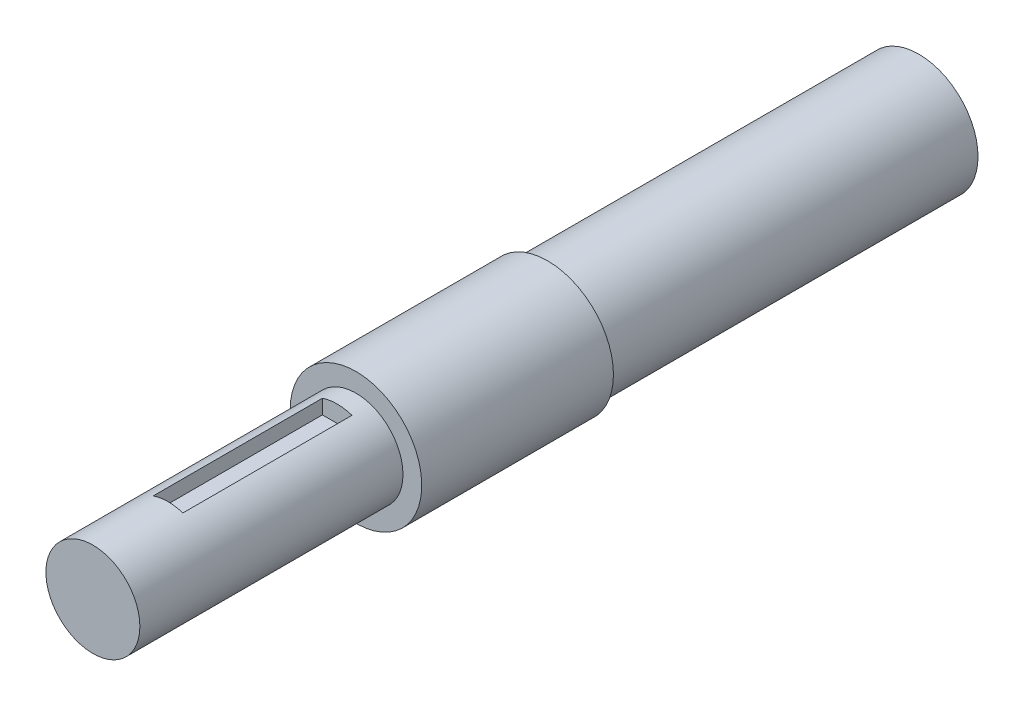
ISO-10303-21;
HEADER;
FILE_DESCRIPTION(('STEP AP214'),'2;1');
FILE_NAME('part.step','',(''),(''),'','','');
FILE_SCHEMA(('AUTOMOTIVE_DESIGN { 1 0 10303 214 1 1 1 1 }'));
ENDSEC;
DATA;
#1=APPLICATION_CONTEXT('core data for automotive mechanical design processes');
#2=APPLICATION_PROTOCOL_DEFINITION('international standard','automotive_design',2000,#1);
#3=PRODUCT_CONTEXT('',#1,'mechanical');
#4=PRODUCT('Part','Part','',(#3));
#5=PRODUCT_RELATED_PRODUCT_CATEGORY('part','',(#4));
#6=PRODUCT_DEFINITION_FORMATION('','',#4);
#7=PRODUCT_DEFINITION_CONTEXT('part definition',#1,'design');
#8=PRODUCT_DEFINITION('design','',#6,#7);
#9=PRODUCT_DEFINITION_SHAPE('','',#8);
#10=(LENGTH_UNIT() NAMED_UNIT(*) SI_UNIT(.MILLI.,.METRE.));
#11=(NAMED_UNIT(*) PLANE_ANGLE_UNIT() SI_UNIT($,.RADIAN.));
#12=(NAMED_UNIT(*) SI_UNIT($,.STERADIAN.) SOLID_ANGLE_UNIT());
#13=UNCERTAINTY_MEASURE_WITH_UNIT(LENGTH_MEASURE(1.E-05),#10,'distance_accuracy_value','');
#14=(GEOMETRIC_REPRESENTATION_CONTEXT(3) GLOBAL_UNCERTAINTY_ASSIGNED_CONTEXT((#13)) GLOBAL_UNIT_ASSIGNED_CONTEXT((#10,
#11,#12)) REPRESENTATION_CONTEXT('',''));
#15=CARTESIAN_POINT('',(0.,0.,0.));
#16=DIRECTION('',(0.,0.,1.));
#17=DIRECTION('',(1.,0.,0.));
#18=AXIS2_PLACEMENT_3D('',#15,#16,#17);
#19=CARTESIAN_POINT('',(11.1125,0.,35.56));
#20=DIRECTION('',(0.,0.,1.));
#21=DIRECTION('',(1.,0.,0.));
#22=AXIS2_PLACEMENT_3D('',#19,#20,#21);
#23=PLANE('',#22);
#24=CARTESIAN_POINT('',(-1.58089684390823E-13,-1.5277276250422E-13,35.56));
#25=DIRECTION('',(0.,0.,1.));
#26=DIRECTION('',(1.,0.,0.));
#27=AXIS2_PLACEMENT_3D('',#24,#25,#26);
#28=CIRCLE('',#27,7.9375);
#29=CARTESIAN_POINT('',(7.93749999999984,-1.5277276250422E-13,35.56));
#30=VERTEX_POINT('',#29);
#31=EDGE_CURVE('E94',#30,#30,#28,.T.);
#32=ORIENTED_EDGE('',*,*,#31,.F.);
#33=EDGE_LOOP('',(#32));
#34=FACE_BOUND('',#33,.T.);
#35=CARTESIAN_POINT('',(0.,0.,35.56));
#36=DIRECTION('',(0.,0.,-1.));
#37=DIRECTION('',(-1.,0.,0.));
#38=AXIS2_PLACEMENT_3D('',#35,#36,#37);
#39=CIRCLE('',#38,11.1125);
#40=CARTESIAN_POINT('',(-11.1125,0.,35.56));
#41=VERTEX_POINT('',#40);
#42=EDGE_CURVE('E86',#41,#41,#39,.T.);
#43=ORIENTED_EDGE('',*,*,#42,.F.);
#44=EDGE_LOOP('',(#43));
#45=FACE_BOUND('',#44,.T.);
#46=ADVANCED_FACE('F17',(#34,#45),#23,.T.);
#47=CARTESIAN_POINT('',(-1.58089684390823E-13,-1.5277276250422E-13,80.01));
#48=DIRECTION('',(0.,0.,1.));
#49=DIRECTION('',(1.,0.,0.));
#50=AXIS2_PLACEMENT_3D('',#47,#48,#49);
#51=PLANE('',#50);
#52=CARTESIAN_POINT('',(-1.58089684390823E-13,-1.5277276250422E-13,80.01));
#53=DIRECTION('',(0.,0.,1.));
#54=DIRECTION('',(1.,0.,0.));
#55=AXIS2_PLACEMENT_3D('',#52,#53,#54);
#56=CIRCLE('',#55,7.9375);
#57=CARTESIAN_POINT('',(7.93749999999984,-1.5277276250422E-13,80.01));
#58=VERTEX_POINT('',#57);
#59=EDGE_CURVE('E102',#58,#58,#56,.T.);
#60=ORIENTED_EDGE('',*,*,#59,.T.);
#61=EDGE_LOOP('',(#60));
#62=FACE_BOUND('',#61,.T.);
#63=ADVANCED_FACE('F249',(#62),#51,.T.);
#64=CARTESIAN_POINT('',(2.499999953,14.0335000000001,67.31));
#65=DIRECTION('',(0.,0.,1.));
#66=DIRECTION('',(1.,0.,0.));
#67=AXIS2_PLACEMENT_3D('',#64,#65,#66);
#68=PLANE('',#67);
#69=DIRECTION('',(0.,-1.,0.));
#70=VECTOR('',#69,1.);
#71=CARTESIAN_POINT('',(2.499999953,14.0335000000001,67.31));
#72=LINE('',#71,#70);
#73=CARTESIAN_POINT('',(2.499999953,7.53351886471368,67.31));
#74=VERTEX_POINT('',#73);
#75=CARTESIAN_POINT('',(2.499999953,5.09295630667743,67.31));
#76=VERTEX_POINT('',#75);
#77=EDGE_CURVE('E11',#74,#76,#72,.T.);
#78=ORIENTED_EDGE('',*,*,#77,.T.);
#79=DIRECTION('',(-1.,0.,0.));
#80=VECTOR('',#79,1.);
#81=CARTESIAN_POINT('',(2.499999953,5.09295630667743,67.31));
#82=LINE('',#81,#80);
#83=CARTESIAN_POINT('',(-2.499999953,5.09295630667743,67.31));
#84=VERTEX_POINT('',#83);
#85=EDGE_CURVE('E123',#76,#84,#82,.T.);
#86=ORIENTED_EDGE('',*,*,#85,.T.);
#87=DIRECTION('',(0.,-1.,0.));
#88=VECTOR('',#87,1.);
#89=CARTESIAN_POINT('',(-2.499999953,14.0335000000001,67.31));
#90=LINE('',#89,#88);
#91=CARTESIAN_POINT('',(-2.499999953,7.53351886471379,67.31));
#92=VERTEX_POINT('',#91);
#93=EDGE_CURVE('E114',#92,#84,#90,.T.);
#94=ORIENTED_EDGE('',*,*,#93,.F.);
#95=CARTESIAN_POINT('',(-1.58089684390823E-13,-1.5277276250422E-13,67.31));
#96=DIRECTION('',(0.,0.,1.));
#97=DIRECTION('',(1.,0.,0.));
#98=AXIS2_PLACEMENT_3D('',#95,#96,#97);
#99=CIRCLE('',#98,7.9375);
#100=EDGE_CURVE('E91',#74,#92,#99,.T.);
#101=ORIENTED_EDGE('',*,*,#100,.F.);
#102=EDGE_LOOP('',(#78,#86,#94,#101));
#103=FACE_BOUND('',#102,.T.);
#104=ADVANCED_FACE('F254',(#103),#68,.F.);
#105=CARTESIAN_POINT('',(2.499999953,14.0335000000001,38.735));
#106=DIRECTION('',(1.,0.,0.));
#107=DIRECTION('',(0.,0.,1.));
#108=AXIS2_PLACEMENT_3D('',#105,#106,#107);
#109=PLANE('',#108);
#110=DIRECTION('',(0.,-1.,0.));
#111=VECTOR('',#110,1.);
#112=CARTESIAN_POINT('',(2.499999953,14.0335000000001,38.735));
#113=LINE('',#112,#111);
#114=CARTESIAN_POINT('',(2.499999953,7.53351886471368,38.735));
#115=VERTEX_POINT('',#114);
#116=CARTESIAN_POINT('',(2.499999953,5.09295630667743,38.735));
#117=VERTEX_POINT('',#116);
#118=EDGE_CURVE('E25',#115,#117,#113,.T.);
#119=ORIENTED_EDGE('',*,*,#118,.T.);
#120=DIRECTION('',(0.,0.,1.));
#121=VECTOR('',#120,1.);
#122=CARTESIAN_POINT('',(2.499999953,5.09295630667743,38.735));
#123=LINE('',#122,#121);
#124=EDGE_CURVE('E126',#117,#76,#123,.T.);
#125=ORIENTED_EDGE('',*,*,#124,.T.);
#126=ORIENTED_EDGE('',*,*,#77,.F.);
#127=DIRECTION('',(0.,0.,1.));
#128=VECTOR('',#127,1.);
#129=CARTESIAN_POINT('',(2.49999995299999,7.53351886471368,80.01));
#130=LINE('',#129,#128);
#131=EDGE_CURVE('E82',#115,#74,#130,.T.);
#132=ORIENTED_EDGE('',*,*,#131,.F.);
#133=EDGE_LOOP('',(#119,#125,#126,#132));
#134=FACE_BOUND('',#133,.T.);
#135=ADVANCED_FACE('F89',(#134),#109,.F.);
#136=CARTESIAN_POINT('',(-2.49999995299999,14.0335000000001,38.735));
#137=DIRECTION('',(0.,0.,-1.));
#138=DIRECTION('',(0.,-1.,0.));
#139=AXIS2_PLACEMENT_3D('',#136,#137,#138);
#140=PLANE('',#139);
#141=DIRECTION('',(0.,-1.,0.));
#142=VECTOR('',#141,1.);
#143=CARTESIAN_POINT('',(-2.49999995299999,14.0335000000001,38.735));
#144=LINE('',#143,#142);
#145=CARTESIAN_POINT('',(-2.499999953,7.53351886471379,38.735));
#146=VERTEX_POINT('',#145);
#147=CARTESIAN_POINT('',(-2.49999995299999,5.09295630667743,38.735));
#148=VERTEX_POINT('',#147);
#149=EDGE_CURVE('E36',#146,#148,#144,.T.);
#150=ORIENTED_EDGE('',*,*,#149,.T.);
#151=DIRECTION('',(1.,0.,0.));
#152=VECTOR('',#151,1.);
#153=CARTESIAN_POINT('',(-2.49999995299999,5.09295630667743,38.735));
#154=LINE('',#153,#152);
#155=EDGE_CURVE('E76',#148,#117,#154,.T.);
#156=ORIENTED_EDGE('',*,*,#155,.T.);
#157=ORIENTED_EDGE('',*,*,#118,.F.);
#158=CARTESIAN_POINT('',(-1.58089684390823E-13,-1.5277276250422E-13,38.735));
#159=DIRECTION('',(0.,0.,-1.));
#160=DIRECTION('',(-1.,0.,0.));
#161=AXIS2_PLACEMENT_3D('',#158,#159,#160);
#162=CIRCLE('',#161,7.9375);
#163=EDGE_CURVE('E73',#146,#115,#162,.T.);
#164=ORIENTED_EDGE('',*,*,#163,.F.);
#165=EDGE_LOOP('',(#150,#156,#157,#164));
#166=FACE_BOUND('',#165,.T.);
#167=ADVANCED_FACE('F71',(#166),#140,.F.);
#168=CARTESIAN_POINT('',(-2.499999953,14.0335000000001,67.31));
#169=DIRECTION('',(-1.,0.,0.));
#170=DIRECTION('',(0.,0.,1.));
#171=AXIS2_PLACEMENT_3D('',#168,#169,#170);
#172=PLANE('',#171);
#173=ORIENTED_EDGE('',*,*,#93,.T.);
#174=DIRECTION('',(0.,0.,-1.));
#175=VECTOR('',#174,1.);
#176=CARTESIAN_POINT('',(-2.499999953,5.09295630667743,67.31));
#177=LINE('',#176,#175);
#178=EDGE_CURVE('E116',#84,#148,#177,.T.);
#179=ORIENTED_EDGE('',*,*,#178,.T.);
#180=ORIENTED_EDGE('',*,*,#149,.F.);
#181=DIRECTION('',(0.,0.,-1.));
#182=VECTOR('',#181,1.);
#183=CARTESIAN_POINT('',(-2.499999953,7.53351886471379,80.01));
#184=LINE('',#183,#182);
#185=EDGE_CURVE('E88',#92,#146,#184,.T.);
#186=ORIENTED_EDGE('',*,*,#185,.F.);
#187=EDGE_LOOP('',(#173,#179,#180,#186));
#188=FACE_BOUND('',#187,.T.);
#189=ADVANCED_FACE('F272',(#188),#172,.F.);
#190=CARTESIAN_POINT('',(0.,5.09295630667743,0.));
#191=DIRECTION('',(0.,-1.,0.));
#192=DIRECTION('',(0.,0.,-1.));
#193=AXIS2_PLACEMENT_3D('',#190,#191,#192);
#194=PLANE('',#193);
#195=ORIENTED_EDGE('',*,*,#85,.F.);
#196=ORIENTED_EDGE('',*,*,#124,.F.);
#197=ORIENTED_EDGE('',*,*,#155,.F.);
#198=ORIENTED_EDGE('',*,*,#178,.F.);
#199=EDGE_LOOP('',(#195,#196,#197,#198));
#200=FACE_BOUND('',#199,.T.);
#201=ADVANCED_FACE('F271',(#200),#194,.F.);
#202=CARTESIAN_POINT('',(0.,0.,3.175));
#203=DIRECTION('',(0.,0.,1.));
#204=DIRECTION('',(1.,0.,0.));
#205=AXIS2_PLACEMENT_3D('',#202,#203,#204);
#206=PLANE('',#205);
#207=CARTESIAN_POINT('',(0.,0.,3.175));
#208=DIRECTION('',(0.,0.,1.));
#209=DIRECTION('',(1.,0.,0.));
#210=AXIS2_PLACEMENT_3D('',#207,#208,#209);
#211=CIRCLE('',#210,10.);
#212=CARTESIAN_POINT('',(10.,0.,3.175));
#213=VERTEX_POINT('',#212);
#214=EDGE_CURVE('E110',#213,#213,#211,.T.);
#215=ORIENTED_EDGE('',*,*,#214,.T.);
#216=EDGE_LOOP('',(#215));
#217=FACE_BOUND('',#216,.T.);
#218=CARTESIAN_POINT('',(0.,0.,3.175));
#219=DIRECTION('',(0.,0.,-1.));
#220=DIRECTION('',(1.,0.,0.));
#221=AXIS2_PLACEMENT_3D('',#218,#219,#220);
#222=CIRCLE('',#221,11.1125);
#223=CARTESIAN_POINT('',(11.1125,0.,3.175));
#224=VERTEX_POINT('',#223);
#225=EDGE_CURVE('E125',#224,#224,#222,.T.);
#226=ORIENTED_EDGE('',*,*,#225,.T.);
#227=EDGE_LOOP('',(#226));
#228=FACE_BOUND('',#227,.T.);
#229=ADVANCED_FACE('F270',(#217,#228),#206,.F.);
#230=CARTESIAN_POINT('',(0.,0.,-59.53125));
#231=DIRECTION('',(0.,0.,-1.));
#232=DIRECTION('',(-1.,0.,0.));
#233=AXIS2_PLACEMENT_3D('',#230,#231,#232);
#234=PLANE('',#233);
#235=CARTESIAN_POINT('',(0.,0.,-59.53125));
#236=DIRECTION('',(0.,0.,-1.));
#237=DIRECTION('',(-1.,0.,0.));
#238=AXIS2_PLACEMENT_3D('',#235,#236,#237);
#239=CIRCLE('',#238,10.);
#240=CARTESIAN_POINT('',(-10.,0.,-59.53125));
#241=VERTEX_POINT('',#240);
#242=EDGE_CURVE('E212',#241,#241,#239,.T.);
#243=ORIENTED_EDGE('',*,*,#242,.T.);
#244=EDGE_LOOP('',(#243));
#245=FACE_BOUND('',#244,.T.);
#246=ADVANCED_FACE('F232',(#245),#234,.T.);
#247=CARTESIAN_POINT('',(0.,0.,35.56));
#248=DIRECTION('',(0.,0.,-1.));
#249=DIRECTION('',(-1.,0.,0.));
#250=AXIS2_PLACEMENT_3D('',#247,#248,#249);
#251=CYLINDRICAL_SURFACE('',#250,11.1125);
#252=ORIENTED_EDGE('',*,*,#225,.F.);
#253=EDGE_LOOP('',(#252));
#254=FACE_BOUND('',#253,.T.);
#255=ORIENTED_EDGE('',*,*,#42,.T.);
#256=EDGE_LOOP('',(#255));
#257=FACE_BOUND('',#256,.T.);
#258=ADVANCED_FACE('F243',(#254,#257),#251,.T.);
#259=CARTESIAN_POINT('',(-1.58089684390823E-13,-1.5277276250422E-13,80.01));
#260=DIRECTION('',(0.,0.,-1.));
#261=DIRECTION('',(-1.,0.,0.));
#262=AXIS2_PLACEMENT_3D('',#259,#260,#261);
#263=CYLINDRICAL_SURFACE('',#262,7.9375);
#264=ORIENTED_EDGE('',*,*,#31,.T.);
#265=EDGE_LOOP('',(#264));
#266=FACE_BOUND('',#265,.T.);
#267=ORIENTED_EDGE('',*,*,#131,.T.);
#268=ORIENTED_EDGE('',*,*,#100,.T.);
#269=ORIENTED_EDGE('',*,*,#185,.T.);
#270=ORIENTED_EDGE('',*,*,#163,.T.);
#271=EDGE_LOOP('',(#267,#268,#269,#270));
#272=FACE_BOUND('',#271,.T.);
#273=ORIENTED_EDGE('',*,*,#59,.F.);
#274=EDGE_LOOP('',(#273));
#275=FACE_BOUND('',#274,.T.);
#276=ADVANCED_FACE('F81',(#266,#272,#275),#263,.T.);
#277=CARTESIAN_POINT('',(0.,0.,-59.53125));
#278=DIRECTION('',(0.,0.,1.));
#279=DIRECTION('',(1.,0.,0.));
#280=AXIS2_PLACEMENT_3D('',#277,#278,#279);
#281=CYLINDRICAL_SURFACE('',#280,10.);
#282=ORIENTED_EDGE('',*,*,#214,.F.);
#283=EDGE_LOOP('',(#282));
#284=FACE_BOUND('',#283,.T.);
#285=ORIENTED_EDGE('',*,*,#242,.F.);
#286=EDGE_LOOP('',(#285));
#287=FACE_BOUND('',#286,.T.);
#288=ADVANCED_FACE('F240',(#284,#287),#281,.T.);
#289=CLOSED_SHELL('',(#46,#63,#104,#135,#167,#189,#201,#229,#246,#258,#276,#288));
#290=MANIFOLD_SOLID_BREP('B1',#289);
#291=ADVANCED_BREP_SHAPE_REPRESENTATION('',(#18,#290),#14);
#292=SHAPE_DEFINITION_REPRESENTATION(#9,#291);
ENDSEC;
END-ISO-10303-21;
